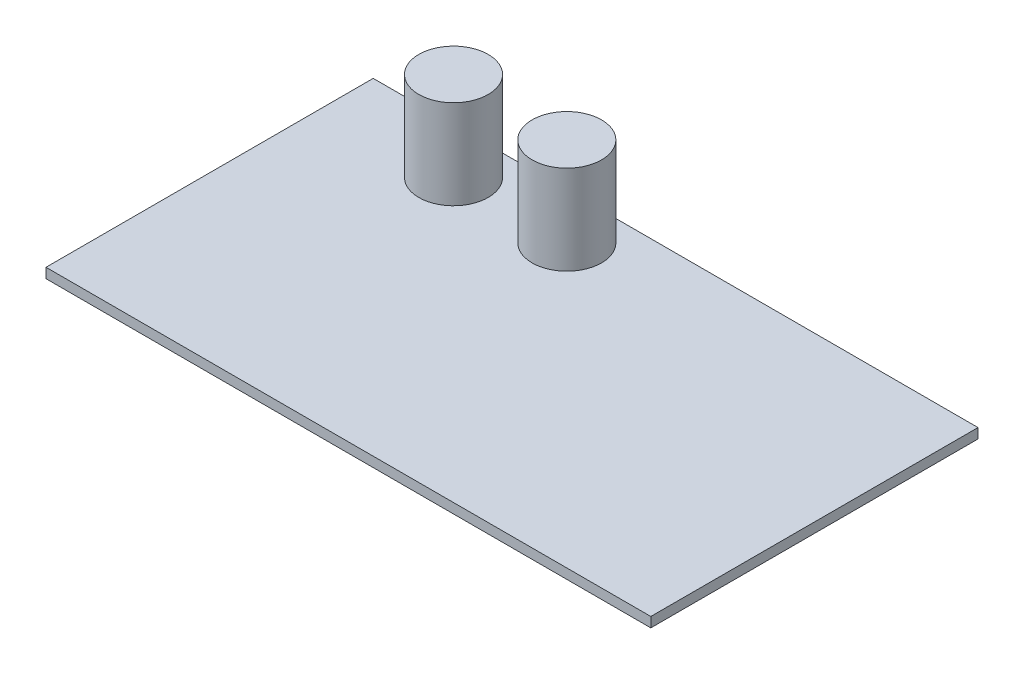
ISO-10303-21;
HEADER;
FILE_DESCRIPTION(('STEP AP214'),'2;1');
FILE_NAME('part.step','',(''),(''),'','','');
FILE_SCHEMA(('AUTOMOTIVE_DESIGN { 1 0 10303 214 1 1 1 1 }'));
ENDSEC;
DATA;
#1=APPLICATION_CONTEXT('core data for automotive mechanical design processes');
#2=APPLICATION_PROTOCOL_DEFINITION('international standard','automotive_design',2000,#1);
#3=PRODUCT_CONTEXT('',#1,'mechanical');
#4=PRODUCT('Part','Part','',(#3));
#5=PRODUCT_RELATED_PRODUCT_CATEGORY('part','',(#4));
#6=PRODUCT_DEFINITION_FORMATION('','',#4);
#7=PRODUCT_DEFINITION_CONTEXT('part definition',#1,'design');
#8=PRODUCT_DEFINITION('design','',#6,#7);
#9=PRODUCT_DEFINITION_SHAPE('','',#8);
#10=(LENGTH_UNIT() NAMED_UNIT(*) SI_UNIT(.MILLI.,.METRE.));
#11=(NAMED_UNIT(*) PLANE_ANGLE_UNIT() SI_UNIT($,.RADIAN.));
#12=(NAMED_UNIT(*) SI_UNIT($,.STERADIAN.) SOLID_ANGLE_UNIT());
#13=UNCERTAINTY_MEASURE_WITH_UNIT(LENGTH_MEASURE(1.E-05),#10,'distance_accuracy_value','');
#14=(GEOMETRIC_REPRESENTATION_CONTEXT(3) GLOBAL_UNCERTAINTY_ASSIGNED_CONTEXT((#13)) GLOBAL_UNIT_ASSIGNED_CONTEXT((#10,
#11,#12)) REPRESENTATION_CONTEXT('',''));
#15=CARTESIAN_POINT('',(0.,0.,0.));
#16=DIRECTION('',(0.,0.,1.));
#17=DIRECTION('',(1.,0.,0.));
#18=AXIS2_PLACEMENT_3D('',#15,#16,#17);
#19=CARTESIAN_POINT('',(-30.5,1.,16.5));
#20=DIRECTION('',(1.,0.,0.));
#21=DIRECTION('',(0.,0.,-1.));
#22=AXIS2_PLACEMENT_3D('',#19,#20,#21);
#23=PLANE('',#22);
#24=DIRECTION('',(0.,0.,1.));
#25=VECTOR('',#24,1.);
#26=CARTESIAN_POINT('',(-30.5,0.,16.5));
#27=LINE('',#26,#25);
#28=CARTESIAN_POINT('',(-30.5,0.,-16.5));
#29=VERTEX_POINT('',#28);
#30=CARTESIAN_POINT('',(-30.5,0.,16.5));
#31=VERTEX_POINT('',#30);
#32=EDGE_CURVE('E95',#29,#31,#27,.T.);
#33=ORIENTED_EDGE('',*,*,#32,.T.);
#34=DIRECTION('',(0.,-1.,0.));
#35=VECTOR('',#34,1.);
#36=CARTESIAN_POINT('',(-30.5,1.,16.5));
#37=LINE('',#36,#35);
#38=CARTESIAN_POINT('',(-30.5,1.,16.5));
#39=VERTEX_POINT('',#38);
#40=EDGE_CURVE('E11',#39,#31,#37,.T.);
#41=ORIENTED_EDGE('',*,*,#40,.F.);
#42=DIRECTION('',(0.,0.,1.));
#43=VECTOR('',#42,1.);
#44=CARTESIAN_POINT('',(-30.5,1.,16.5));
#45=LINE('',#44,#43);
#46=CARTESIAN_POINT('',(-30.5,1.,-16.5));
#47=VERTEX_POINT('',#46);
#48=EDGE_CURVE('E83',#47,#39,#45,.T.);
#49=ORIENTED_EDGE('',*,*,#48,.F.);
#50=DIRECTION('',(0.,-1.,0.));
#51=VECTOR('',#50,1.);
#52=CARTESIAN_POINT('',(-30.5,1.,-16.5));
#53=LINE('',#52,#51);
#54=EDGE_CURVE('E91',#47,#29,#53,.T.);
#55=ORIENTED_EDGE('',*,*,#54,.T.);
#56=EDGE_LOOP('',(#33,#41,#49,#55));
#57=FACE_BOUND('',#56,.T.);
#58=ADVANCED_FACE('F32',(#57),#23,.F.);
#59=CARTESIAN_POINT('',(30.5,1.,16.5));
#60=DIRECTION('',(0.,0.,-1.));
#61=DIRECTION('',(-1.,0.,0.));
#62=AXIS2_PLACEMENT_3D('',#59,#60,#61);
#63=PLANE('',#62);
#64=DIRECTION('',(1.,0.,0.));
#65=VECTOR('',#64,1.);
#66=CARTESIAN_POINT('',(30.5,0.,16.5));
#67=LINE('',#66,#65);
#68=CARTESIAN_POINT('',(30.5,0.,16.5));
#69=VERTEX_POINT('',#68);
#70=EDGE_CURVE('E87',#31,#69,#67,.T.);
#71=ORIENTED_EDGE('',*,*,#70,.T.);
#72=DIRECTION('',(0.,-1.,0.));
#73=VECTOR('',#72,1.);
#74=CARTESIAN_POINT('',(30.5,1.,16.5));
#75=LINE('',#74,#73);
#76=CARTESIAN_POINT('',(30.5,1.,16.5));
#77=VERTEX_POINT('',#76);
#78=EDGE_CURVE('E40',#77,#69,#75,.T.);
#79=ORIENTED_EDGE('',*,*,#78,.F.);
#80=DIRECTION('',(1.,0.,0.));
#81=VECTOR('',#80,1.);
#82=CARTESIAN_POINT('',(30.5,1.,16.5));
#83=LINE('',#82,#81);
#84=EDGE_CURVE('E78',#39,#77,#83,.T.);
#85=ORIENTED_EDGE('',*,*,#84,.F.);
#86=ORIENTED_EDGE('',*,*,#40,.T.);
#87=EDGE_LOOP('',(#71,#79,#85,#86));
#88=FACE_BOUND('',#87,.T.);
#89=ADVANCED_FACE('F86',(#88),#63,.F.);
#90=CARTESIAN_POINT('',(30.5,1.,16.5));
#91=DIRECTION('',(-1.,0.,0.));
#92=DIRECTION('',(0.,0.,1.));
#93=AXIS2_PLACEMENT_3D('',#90,#91,#92);
#94=PLANE('',#93);
#95=DIRECTION('',(0.,0.,-1.));
#96=VECTOR('',#95,1.);
#97=CARTESIAN_POINT('',(30.5,0.,16.5));
#98=LINE('',#97,#96);
#99=CARTESIAN_POINT('',(30.5,0.,-16.5));
#100=VERTEX_POINT('',#99);
#101=EDGE_CURVE('E65',#69,#100,#98,.T.);
#102=ORIENTED_EDGE('',*,*,#101,.T.);
#103=DIRECTION('',(0.,-1.,0.));
#104=VECTOR('',#103,1.);
#105=CARTESIAN_POINT('',(30.5,1.,-16.5));
#106=LINE('',#105,#104);
#107=CARTESIAN_POINT('',(30.5,1.,-16.5));
#108=VERTEX_POINT('',#107);
#109=EDGE_CURVE('E88',#108,#100,#106,.T.);
#110=ORIENTED_EDGE('',*,*,#109,.F.);
#111=DIRECTION('',(0.,0.,-1.));
#112=VECTOR('',#111,1.);
#113=CARTESIAN_POINT('',(30.5,1.,16.5));
#114=LINE('',#113,#112);
#115=EDGE_CURVE('E81',#77,#108,#114,.T.);
#116=ORIENTED_EDGE('',*,*,#115,.F.);
#117=ORIENTED_EDGE('',*,*,#78,.T.);
#118=EDGE_LOOP('',(#102,#110,#116,#117));
#119=FACE_BOUND('',#118,.T.);
#120=ADVANCED_FACE('F89',(#119),#94,.F.);
#121=CARTESIAN_POINT('',(30.5,1.,-16.5));
#122=DIRECTION('',(0.,0.,1.));
#123=DIRECTION('',(1.,0.,0.));
#124=AXIS2_PLACEMENT_3D('',#121,#122,#123);
#125=PLANE('',#124);
#126=DIRECTION('',(-1.,0.,0.));
#127=VECTOR('',#126,1.);
#128=CARTESIAN_POINT('',(30.5,0.,-16.5));
#129=LINE('',#128,#127);
#130=EDGE_CURVE('E71',#100,#29,#129,.T.);
#131=ORIENTED_EDGE('',*,*,#130,.T.);
#132=ORIENTED_EDGE('',*,*,#54,.F.);
#133=DIRECTION('',(-1.,0.,0.));
#134=VECTOR('',#133,1.);
#135=CARTESIAN_POINT('',(30.5,1.,-16.5));
#136=LINE('',#135,#134);
#137=EDGE_CURVE('E48',#108,#47,#136,.T.);
#138=ORIENTED_EDGE('',*,*,#137,.F.);
#139=ORIENTED_EDGE('',*,*,#109,.T.);
#140=EDGE_LOOP('',(#131,#132,#138,#139));
#141=FACE_BOUND('',#140,.T.);
#142=ADVANCED_FACE('F103',(#141),#125,.F.);
#143=CARTESIAN_POINT('',(0.,1.,0.));
#144=DIRECTION('',(0.,1.,0.));
#145=DIRECTION('',(0.,0.,1.));
#146=AXIS2_PLACEMENT_3D('',#143,#144,#145);
#147=PLANE('',#146);
#148=CARTESIAN_POINT('',(-6.3635294746406,1.,-11.8930041152263));
#149=DIRECTION('',(0.,1.,0.));
#150=DIRECTION('',(0.,0.,1.));
#151=AXIS2_PLACEMENT_3D('',#148,#149,#150);
#152=CIRCLE('',#151,3.5);
#153=CARTESIAN_POINT('',(-6.3635294746406,1.,-8.39300411522635));
#154=VERTEX_POINT('',#153);
#155=EDGE_CURVE('E115',#154,#154,#152,.T.);
#156=ORIENTED_EDGE('',*,*,#155,.F.);
#157=EDGE_LOOP('',(#156));
#158=FACE_BOUND('',#157,.T.);
#159=CARTESIAN_POINT('',(-17.7931697931698,1.,-11.8930041152263));
#160=DIRECTION('',(0.,1.,0.));
#161=DIRECTION('',(0.,0.,1.));
#162=AXIS2_PLACEMENT_3D('',#159,#160,#161);
#163=CIRCLE('',#162,3.5);
#164=CARTESIAN_POINT('',(-17.7931697931698,1.,-8.39300411522635));
#165=VERTEX_POINT('',#164);
#166=EDGE_CURVE('E109',#165,#165,#163,.T.);
#167=ORIENTED_EDGE('',*,*,#166,.F.);
#168=EDGE_LOOP('',(#167));
#169=FACE_BOUND('',#168,.T.);
#170=ORIENTED_EDGE('',*,*,#48,.T.);
#171=ORIENTED_EDGE('',*,*,#84,.T.);
#172=ORIENTED_EDGE('',*,*,#115,.T.);
#173=ORIENTED_EDGE('',*,*,#137,.T.);
#174=EDGE_LOOP('',(#170,#171,#172,#173));
#175=FACE_BOUND('',#174,.T.);
#176=ADVANCED_FACE('F79',(#158,#169,#175),#147,.T.);
#177=CARTESIAN_POINT('',(0.,0.,0.));
#178=DIRECTION('',(0.,1.,0.));
#179=DIRECTION('',(0.,0.,1.));
#180=AXIS2_PLACEMENT_3D('',#177,#178,#179);
#181=PLANE('',#180);
#182=ORIENTED_EDGE('',*,*,#32,.F.);
#183=ORIENTED_EDGE('',*,*,#130,.F.);
#184=ORIENTED_EDGE('',*,*,#101,.F.);
#185=ORIENTED_EDGE('',*,*,#70,.F.);
#186=EDGE_LOOP('',(#182,#183,#184,#185));
#187=FACE_BOUND('',#186,.T.);
#188=ADVANCED_FACE('F106',(#187),#181,.F.);
#189=CARTESIAN_POINT('',(-17.7931697931698,10.,-11.8930041152263));
#190=DIRECTION('',(0.,-1.,0.));
#191=DIRECTION('',(0.,0.,-1.));
#192=AXIS2_PLACEMENT_3D('',#189,#190,#191);
#193=CYLINDRICAL_SURFACE('',#192,3.5);
#194=CARTESIAN_POINT('',(-17.7931697931698,10.,-11.8930041152263));
#195=DIRECTION('',(0.,1.,0.));
#196=DIRECTION('',(0.,0.,1.));
#197=AXIS2_PLACEMENT_3D('',#194,#195,#196);
#198=CIRCLE('',#197,3.5);
#199=CARTESIAN_POINT('',(-17.7931697931698,10.,-8.39300411522635));
#200=VERTEX_POINT('',#199);
#201=EDGE_CURVE('E98',#200,#200,#198,.T.);
#202=ORIENTED_EDGE('',*,*,#201,.F.);
#203=EDGE_LOOP('',(#202));
#204=FACE_BOUND('',#203,.T.);
#205=ORIENTED_EDGE('',*,*,#166,.T.);
#206=EDGE_LOOP('',(#205));
#207=FACE_BOUND('',#206,.T.);
#208=ADVANCED_FACE('F135',(#204,#207),#193,.T.);
#209=CARTESIAN_POINT('',(-17.7931697931698,10.,-11.8930041152263));
#210=DIRECTION('',(0.,1.,0.));
#211=DIRECTION('',(0.,0.,1.));
#212=AXIS2_PLACEMENT_3D('',#209,#210,#211);
#213=PLANE('',#212);
#214=ORIENTED_EDGE('',*,*,#201,.T.);
#215=EDGE_LOOP('',(#214));
#216=FACE_BOUND('',#215,.T.);
#217=ADVANCED_FACE('F126',(#216),#213,.T.);
#218=CARTESIAN_POINT('',(-6.3635294746406,10.,-11.8930041152263));
#219=DIRECTION('',(0.,-1.,0.));
#220=DIRECTION('',(0.,0.,-1.));
#221=AXIS2_PLACEMENT_3D('',#218,#219,#220);
#222=CYLINDRICAL_SURFACE('',#221,3.5);
#223=CARTESIAN_POINT('',(-6.3635294746406,10.,-11.8930041152263));
#224=DIRECTION('',(0.,1.,0.));
#225=DIRECTION('',(0.,0.,1.));
#226=AXIS2_PLACEMENT_3D('',#223,#224,#225);
#227=CIRCLE('',#226,3.5);
#228=CARTESIAN_POINT('',(-6.3635294746406,10.,-8.39300411522635));
#229=VERTEX_POINT('',#228);
#230=EDGE_CURVE('E112',#229,#229,#227,.T.);
#231=ORIENTED_EDGE('',*,*,#230,.F.);
#232=EDGE_LOOP('',(#231));
#233=FACE_BOUND('',#232,.T.);
#234=ORIENTED_EDGE('',*,*,#155,.T.);
#235=EDGE_LOOP('',(#234));
#236=FACE_BOUND('',#235,.T.);
#237=ADVANCED_FACE('F123',(#233,#236),#222,.T.);
#238=CARTESIAN_POINT('',(-6.3635294746406,10.,-11.8930041152263));
#239=DIRECTION('',(0.,1.,0.));
#240=DIRECTION('',(0.,0.,1.));
#241=AXIS2_PLACEMENT_3D('',#238,#239,#240);
#242=PLANE('',#241);
#243=ORIENTED_EDGE('',*,*,#230,.T.);
#244=EDGE_LOOP('',(#243));
#245=FACE_BOUND('',#244,.T.);
#246=ADVANCED_FACE('F121',(#245),#242,.T.);
#247=CLOSED_SHELL('',(#58,#89,#120,#142,#176,#188,#208,#217,#237,#246));
#248=MANIFOLD_SOLID_BREP('B2',#247);
#249=ADVANCED_BREP_SHAPE_REPRESENTATION('',(#18,#248),#14);
#250=SHAPE_DEFINITION_REPRESENTATION(#9,#249);
ENDSEC;
END-ISO-10303-21;
